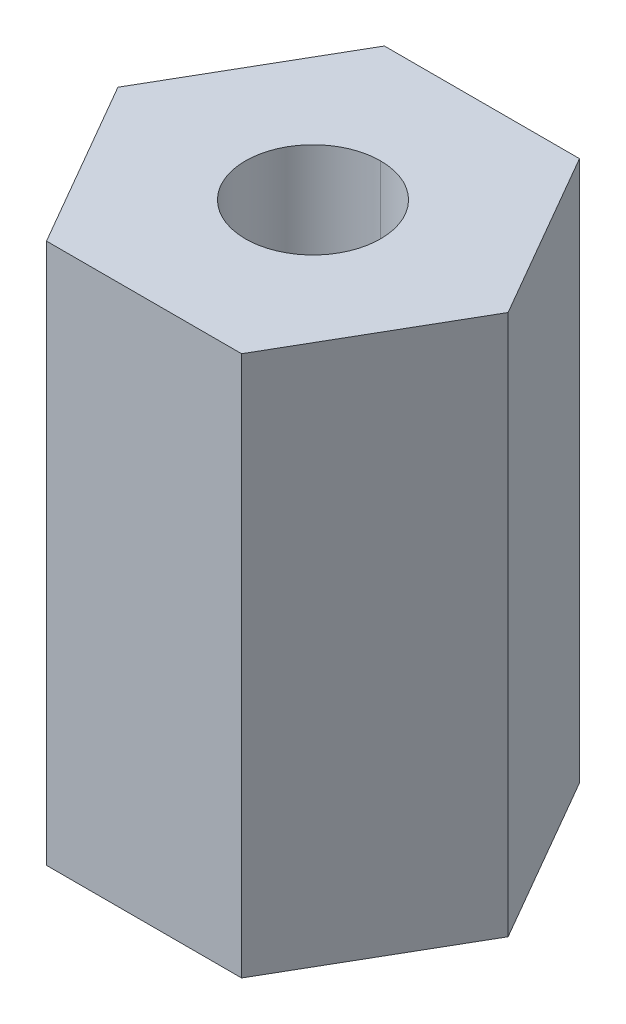
ISO-10303-21;
HEADER;
FILE_DESCRIPTION(('STEP AP214'),'2;1');
FILE_NAME('part.step','',(''),(''),'','','');
FILE_SCHEMA(('AUTOMOTIVE_DESIGN { 1 0 10303 214 1 1 1 1 }'));
ENDSEC;
DATA;
#1=APPLICATION_CONTEXT('core data for automotive mechanical design processes');
#2=APPLICATION_PROTOCOL_DEFINITION('international standard','automotive_design',2000,#1);
#3=PRODUCT_CONTEXT('',#1,'mechanical');
#4=PRODUCT('Part','Part','',(#3));
#5=PRODUCT_RELATED_PRODUCT_CATEGORY('part','',(#4));
#6=PRODUCT_DEFINITION_FORMATION('','',#4);
#7=PRODUCT_DEFINITION_CONTEXT('part definition',#1,'design');
#8=PRODUCT_DEFINITION('design','',#6,#7);
#9=PRODUCT_DEFINITION_SHAPE('','',#8);
#10=(LENGTH_UNIT() NAMED_UNIT(*) SI_UNIT(.MILLI.,.METRE.));
#11=(NAMED_UNIT(*) PLANE_ANGLE_UNIT() SI_UNIT($,.RADIAN.));
#12=(NAMED_UNIT(*) SI_UNIT($,.STERADIAN.) SOLID_ANGLE_UNIT());
#13=UNCERTAINTY_MEASURE_WITH_UNIT(LENGTH_MEASURE(1.E-05),#10,'distance_accuracy_value','');
#14=(GEOMETRIC_REPRESENTATION_CONTEXT(3) GLOBAL_UNCERTAINTY_ASSIGNED_CONTEXT((#13)) GLOBAL_UNIT_ASSIGNED_CONTEXT((#10,
#11,#12)) REPRESENTATION_CONTEXT('',''));
#15=CARTESIAN_POINT('',(0.,0.,0.));
#16=DIRECTION('',(0.,0.,1.));
#17=DIRECTION('',(1.,0.,0.));
#18=AXIS2_PLACEMENT_3D('',#15,#16,#17);
#19=CARTESIAN_POINT('',(0.,8.,1.));
#20=CARTESIAN_POINT('',(-1.,7.99999999999999,1.));
#21=CARTESIAN_POINT('',(-1.,8.,0.));
#22=CARTESIAN_POINT('',(-1.,7.99999999999999,-1.));
#23=CARTESIAN_POINT('',(0.,8.,-1.));
#24=CARTESIAN_POINT('',(0.,0.,1.));
#25=CARTESIAN_POINT('',(-1.,0.,1.));
#26=CARTESIAN_POINT('',(-1.,0.,0.));
#27=CARTESIAN_POINT('',(-1.,0.,-1.));
#28=CARTESIAN_POINT('',(0.,0.,-1.));
#29=(BOUNDED_SURFACE() B_SPLINE_SURFACE(1,2,((#19,#20,#21,#22,#23),(#24,#25,#26,#27,#28)),
.UNSPECIFIED.,.F.,.F.,.F.) B_SPLINE_SURFACE_WITH_KNOTS((2,2),(3,2,3),(-4.,4.),
(-3.14159265358979,-1.5707963267949,0.),
.UNSPECIFIED.) GEOMETRIC_REPRESENTATION_ITEM() RATIONAL_B_SPLINE_SURFACE(((1.,0.707106781186548,
1.,0.707106781186548,1.),(1.,0.707106781186548,1.,0.707106781186548,1.))) REPRESENTATION_ITEM('') SURFACE());
#30=CARTESIAN_POINT('',(0.,8.,-1.));
#31=CARTESIAN_POINT('',(0.,0.,-1.));
#32=(BOUNDED_CURVE() B_SPLINE_CURVE(1,(#30,#31),.UNSPECIFIED.,.F.,
.F.) B_SPLINE_CURVE_WITH_KNOTS((2,2),(-4.,4.),
.UNSPECIFIED.) CURVE() GEOMETRIC_REPRESENTATION_ITEM() RATIONAL_B_SPLINE_CURVE((1.,1.)) REPRESENTATION_ITEM(''));
#33=CARTESIAN_POINT('',(0.,8.,-1.));
#34=VERTEX_POINT('',#33);
#35=CARTESIAN_POINT('',(0.,0.,-1.));
#36=VERTEX_POINT('',#35);
#37=EDGE_CURVE('E193',#34,#36,#32,.T.);
#38=CARTESIAN_POINT('',(0.,8.,1.));
#39=CARTESIAN_POINT('',(-1.,7.99999999999999,1.));
#40=CARTESIAN_POINT('',(-1.,8.,0.));
#41=CARTESIAN_POINT('',(-1.,7.99999999999999,-1.));
#42=CARTESIAN_POINT('',(0.,8.,-1.));
#43=(BOUNDED_CURVE() B_SPLINE_CURVE(2,(#38,#39,#40,#41,#42),.UNSPECIFIED.,.F.,
.F.) B_SPLINE_CURVE_WITH_KNOTS((3,2,3),(0.,1.5707963267949,3.14159265358979),
.UNSPECIFIED.) CURVE() GEOMETRIC_REPRESENTATION_ITEM() RATIONAL_B_SPLINE_CURVE((1.,
0.707106781186548,1.,0.707106781186548,1.)) REPRESENTATION_ITEM(''));
#44=CARTESIAN_POINT('',(0.,8.,1.));
#45=VERTEX_POINT('',#44);
#46=EDGE_CURVE('E82',#45,#34,#43,.T.);
#47=CARTESIAN_POINT('',(0.,8.,1.));
#48=CARTESIAN_POINT('',(0.,0.,1.));
#49=(BOUNDED_CURVE() B_SPLINE_CURVE(1,(#47,#48),.UNSPECIFIED.,.F.,
.F.) B_SPLINE_CURVE_WITH_KNOTS((2,2),(-4.,4.),
.UNSPECIFIED.) CURVE() GEOMETRIC_REPRESENTATION_ITEM() RATIONAL_B_SPLINE_CURVE((1.,1.)) REPRESENTATION_ITEM(''));
#50=CARTESIAN_POINT('',(0.,0.,1.));
#51=VERTEX_POINT('',#50);
#52=EDGE_CURVE('E150',#45,#51,#49,.T.);
#53=CARTESIAN_POINT('',(0.,0.,1.));
#54=CARTESIAN_POINT('',(-1.,0.,1.));
#55=CARTESIAN_POINT('',(-1.,0.,0.));
#56=CARTESIAN_POINT('',(-1.,0.,-1.));
#57=CARTESIAN_POINT('',(0.,0.,-1.));
#58=(BOUNDED_CURVE() B_SPLINE_CURVE(2,(#53,#54,#55,#56,#57),.UNSPECIFIED.,.F.,
.F.) B_SPLINE_CURVE_WITH_KNOTS((3,2,3),(0.,1.5707963267949,3.14159265358979),
.UNSPECIFIED.) CURVE() GEOMETRIC_REPRESENTATION_ITEM() RATIONAL_B_SPLINE_CURVE((1.,
0.707106781186548,1.,0.707106781186548,1.)) REPRESENTATION_ITEM(''));
#59=EDGE_CURVE('E92',#51,#36,#58,.T.);
#60=ORIENTED_EDGE('',*,*,#37,.F.);
#61=ORIENTED_EDGE('',*,*,#46,.F.);
#62=ORIENTED_EDGE('',*,*,#52,.T.);
#63=ORIENTED_EDGE('',*,*,#59,.T.);
#64=EDGE_LOOP('',(#60,#61,#62,#63));
#65=FACE_BOUND('',#64,.T.);
#66=ADVANCED_FACE('F17',(#65),#29,.T.);
#67=CARTESIAN_POINT('',(1.43837567300093,-0.01,2.50866025403838));
#68=CARTESIAN_POINT('',(1.43837567300093,8.01,2.50866025403838));
#69=CARTESIAN_POINT('',(2.89175134571016,-0.01,-0.00866025420518224));
#70=CARTESIAN_POINT('',(2.89175134571016,8.01,-0.00866025420518224));
#71=(BOUNDED_SURFACE() B_SPLINE_SURFACE(1,1,((#67,#68),(#69,#70)),.UNSPECIFIED.,.F.,.F.,
.F.) B_SPLINE_SURFACE_WITH_KNOTS((2,2),(2,2),(-0.28967513459611,0.001),(-0.801,0.001),
.UNSPECIFIED.) GEOMETRIC_REPRESENTATION_ITEM() RATIONAL_B_SPLINE_SURFACE(((1.,1.),(1.,1.))) REPRESENTATION_ITEM('') SURFACE());
#72=CARTESIAN_POINT('',(1.443375673,0.,2.5));
#73=CARTESIAN_POINT('',(2.886751346,0.,0.));
#74=(BOUNDED_CURVE() B_SPLINE_CURVE(1,(#72,#73),.UNSPECIFIED.,.F.,
.F.) B_SPLINE_CURVE_WITH_KNOTS((2,2),(0.,1.),
.UNSPECIFIED.) CURVE() GEOMETRIC_REPRESENTATION_ITEM() RATIONAL_B_SPLINE_CURVE((1.,1.)) REPRESENTATION_ITEM(''));
#75=CARTESIAN_POINT('',(1.443375673,0.,2.5));
#76=VERTEX_POINT('',#75);
#77=CARTESIAN_POINT('',(2.886751346,0.,0.));
#78=VERTEX_POINT('',#77);
#79=EDGE_CURVE('E140',#76,#78,#74,.T.);
#80=CARTESIAN_POINT('',(2.886751346,8.,0.));
#81=CARTESIAN_POINT('',(2.886751346,0.,0.));
#82=(BOUNDED_CURVE() B_SPLINE_CURVE(1,(#80,#81),.UNSPECIFIED.,.F.,
.F.) B_SPLINE_CURVE_WITH_KNOTS((2,2),(0.,1.),
.UNSPECIFIED.) CURVE() GEOMETRIC_REPRESENTATION_ITEM() RATIONAL_B_SPLINE_CURVE((1.,1.)) REPRESENTATION_ITEM(''));
#83=CARTESIAN_POINT('',(2.886751346,8.,0.));
#84=VERTEX_POINT('',#83);
#85=EDGE_CURVE('E11',#84,#78,#82,.T.);
#86=CARTESIAN_POINT('',(1.443375673,8.,2.5));
#87=CARTESIAN_POINT('',(2.886751346,8.,0.));
#88=(BOUNDED_CURVE() B_SPLINE_CURVE(1,(#86,#87),.UNSPECIFIED.,.F.,
.F.) B_SPLINE_CURVE_WITH_KNOTS((2,2),(0.,1.),
.UNSPECIFIED.) CURVE() GEOMETRIC_REPRESENTATION_ITEM() RATIONAL_B_SPLINE_CURVE((1.,1.)) REPRESENTATION_ITEM(''));
#89=CARTESIAN_POINT('',(1.443375673,8.,2.5));
#90=VERTEX_POINT('',#89);
#91=EDGE_CURVE('E246',#90,#84,#88,.T.);
#92=CARTESIAN_POINT('',(1.443375673,8.,2.5));
#93=CARTESIAN_POINT('',(1.443375673,0.,2.5));
#94=(BOUNDED_CURVE() B_SPLINE_CURVE(1,(#92,#93),.UNSPECIFIED.,.F.,
.F.) B_SPLINE_CURVE_WITH_KNOTS((2,2),(0.,1.),
.UNSPECIFIED.) CURVE() GEOMETRIC_REPRESENTATION_ITEM() RATIONAL_B_SPLINE_CURVE((1.,1.)) REPRESENTATION_ITEM(''));
#95=EDGE_CURVE('E146',#90,#76,#94,.T.);
#96=ORIENTED_EDGE('',*,*,#79,.T.);
#97=ORIENTED_EDGE('',*,*,#85,.F.);
#98=ORIENTED_EDGE('',*,*,#91,.F.);
#99=ORIENTED_EDGE('',*,*,#95,.T.);
#100=EDGE_LOOP('',(#96,#97,#98,#99));
#101=FACE_BOUND('',#100,.T.);
#102=ADVANCED_FACE('F145',(#101),#71,.T.);
#103=CARTESIAN_POINT('',(2.89175134599907,-0.01,0.00866025403838329));
#104=CARTESIAN_POINT('',(2.89175134599907,8.01,0.00866025403838344));
#105=CARTESIAN_POINT('',(1.43837567328984,-0.01,-2.50866025420518));
#106=CARTESIAN_POINT('',(1.43837567328984,8.01,-2.50866025420518));
#107=(BOUNDED_SURFACE() B_SPLINE_SURFACE(1,1,((#103,#104),(#105,#106)),.UNSPECIFIED.,.F.,.F.,
.F.) B_SPLINE_SURFACE_WITH_KNOTS((2,2),(2,2),(-0.28967513459611,0.001),(-0.801,0.001),
.UNSPECIFIED.) GEOMETRIC_REPRESENTATION_ITEM() RATIONAL_B_SPLINE_SURFACE(((1.,1.),(1.,1.))) REPRESENTATION_ITEM('') SURFACE());
#108=CARTESIAN_POINT('',(2.886751346,0.,0.));
#109=CARTESIAN_POINT('',(1.443375673,0.,-2.5));
#110=(BOUNDED_CURVE() B_SPLINE_CURVE(1,(#108,#109),.UNSPECIFIED.,.F.,
.F.) B_SPLINE_CURVE_WITH_KNOTS((2,2),(0.,1.),
.UNSPECIFIED.) CURVE() GEOMETRIC_REPRESENTATION_ITEM() RATIONAL_B_SPLINE_CURVE((1.,1.)) REPRESENTATION_ITEM(''));
#111=CARTESIAN_POINT('',(1.443375673,0.,-2.5));
#112=VERTEX_POINT('',#111);
#113=EDGE_CURVE('E128',#78,#112,#110,.T.);
#114=CARTESIAN_POINT('',(1.443375673,8.,-2.5));
#115=CARTESIAN_POINT('',(1.443375673,0.,-2.5));
#116=(BOUNDED_CURVE() B_SPLINE_CURVE(1,(#114,#115),.UNSPECIFIED.,.F.,
.F.) B_SPLINE_CURVE_WITH_KNOTS((2,2),(0.,1.),
.UNSPECIFIED.) CURVE() GEOMETRIC_REPRESENTATION_ITEM() RATIONAL_B_SPLINE_CURVE((1.,1.)) REPRESENTATION_ITEM(''));
#117=CARTESIAN_POINT('',(1.443375673,8.,-2.5));
#118=VERTEX_POINT('',#117);
#119=EDGE_CURVE('E31',#118,#112,#116,.T.);
#120=CARTESIAN_POINT('',(2.886751346,8.,0.));
#121=CARTESIAN_POINT('',(1.443375673,8.,-2.5));
#122=(BOUNDED_CURVE() B_SPLINE_CURVE(1,(#120,#121),.UNSPECIFIED.,.F.,
.F.) B_SPLINE_CURVE_WITH_KNOTS((2,2),(0.,1.),
.UNSPECIFIED.) CURVE() GEOMETRIC_REPRESENTATION_ITEM() RATIONAL_B_SPLINE_CURVE((1.,1.)) REPRESENTATION_ITEM(''));
#123=EDGE_CURVE('E131',#84,#118,#122,.T.);
#124=ORIENTED_EDGE('',*,*,#113,.T.);
#125=ORIENTED_EDGE('',*,*,#119,.F.);
#126=ORIENTED_EDGE('',*,*,#123,.F.);
#127=ORIENTED_EDGE('',*,*,#85,.T.);
#128=EDGE_LOOP('',(#124,#125,#126,#127));
#129=FACE_BOUND('',#128,.T.);
#130=ADVANCED_FACE('F127',(#129),#107,.T.);
#131=CARTESIAN_POINT('',(1.453375673,-0.01,-2.5));
#132=CARTESIAN_POINT('',(1.453375673,8.01,-2.5));
#133=CARTESIAN_POINT('',(-1.453375673,-0.01,-2.5));
#134=CARTESIAN_POINT('',(-1.453375673,8.01,-2.5));
#135=(BOUNDED_SURFACE() B_SPLINE_SURFACE(1,1,((#131,#132),(#133,#134)),.UNSPECIFIED.,.F.,.F.,
.F.) B_SPLINE_SURFACE_WITH_KNOTS((2,2),(2,2),(-0.2896751346,0.001),(-0.801,0.001),
.UNSPECIFIED.) GEOMETRIC_REPRESENTATION_ITEM() RATIONAL_B_SPLINE_SURFACE(((1.,1.),(1.,1.))) REPRESENTATION_ITEM('') SURFACE());
#136=CARTESIAN_POINT('',(1.443375673,0.,-2.5));
#137=CARTESIAN_POINT('',(-1.443375673,0.,-2.5));
#138=(BOUNDED_CURVE() B_SPLINE_CURVE(1,(#136,#137),.UNSPECIFIED.,.F.,
.F.) B_SPLINE_CURVE_WITH_KNOTS((2,2),(0.,1.),
.UNSPECIFIED.) CURVE() GEOMETRIC_REPRESENTATION_ITEM() RATIONAL_B_SPLINE_CURVE((1.,1.)) REPRESENTATION_ITEM(''));
#139=CARTESIAN_POINT('',(-1.443375673,0.,-2.5));
#140=VERTEX_POINT('',#139);
#141=EDGE_CURVE('E142',#112,#140,#138,.T.);
#142=CARTESIAN_POINT('',(-1.443375673,8.,-2.5));
#143=CARTESIAN_POINT('',(-1.443375673,0.,-2.5));
#144=(BOUNDED_CURVE() B_SPLINE_CURVE(1,(#142,#143),.UNSPECIFIED.,.F.,
.F.) B_SPLINE_CURVE_WITH_KNOTS((2,2),(0.,1.),
.UNSPECIFIED.) CURVE() GEOMETRIC_REPRESENTATION_ITEM() RATIONAL_B_SPLINE_CURVE((1.,1.)) REPRESENTATION_ITEM(''));
#145=CARTESIAN_POINT('',(-1.443375673,8.,-2.5));
#146=VERTEX_POINT('',#145);
#147=EDGE_CURVE('E117',#146,#140,#144,.T.);
#148=CARTESIAN_POINT('',(1.443375673,8.,-2.5));
#149=CARTESIAN_POINT('',(-1.443375673,8.,-2.5));
#150=(BOUNDED_CURVE() B_SPLINE_CURVE(1,(#148,#149),.UNSPECIFIED.,.F.,
.F.) B_SPLINE_CURVE_WITH_KNOTS((2,2),(0.,1.),
.UNSPECIFIED.) CURVE() GEOMETRIC_REPRESENTATION_ITEM() RATIONAL_B_SPLINE_CURVE((1.,1.)) REPRESENTATION_ITEM(''));
#151=EDGE_CURVE('E201',#118,#146,#150,.T.);
#152=ORIENTED_EDGE('',*,*,#141,.T.);
#153=ORIENTED_EDGE('',*,*,#147,.F.);
#154=ORIENTED_EDGE('',*,*,#151,.F.);
#155=ORIENTED_EDGE('',*,*,#119,.T.);
#156=EDGE_LOOP('',(#152,#153,#154,#155));
#157=FACE_BOUND('',#156,.T.);
#158=ADVANCED_FACE('F283',(#157),#135,.T.);
#159=CARTESIAN_POINT('',(-1.43837567300093,-0.01,-2.50866025403838));
#160=CARTESIAN_POINT('',(-1.43837567300093,8.01,-2.50866025403838));
#161=CARTESIAN_POINT('',(-2.89175134571016,-0.01,0.00866025420518224));
#162=CARTESIAN_POINT('',(-2.89175134571016,8.01,0.00866025420518224));
#163=(BOUNDED_SURFACE() B_SPLINE_SURFACE(1,1,((#159,#160),(#161,#162)),.UNSPECIFIED.,.F.,.F.,
.F.) B_SPLINE_SURFACE_WITH_KNOTS((2,2),(2,2),(-0.28967513459611,0.001),(-0.801,0.001),
.UNSPECIFIED.) GEOMETRIC_REPRESENTATION_ITEM() RATIONAL_B_SPLINE_SURFACE(((1.,1.),(1.,1.))) REPRESENTATION_ITEM('') SURFACE());
#164=CARTESIAN_POINT('',(-1.443375673,0.,-2.5));
#165=CARTESIAN_POINT('',(-2.886751346,0.,0.));
#166=(BOUNDED_CURVE() B_SPLINE_CURVE(1,(#164,#165),.UNSPECIFIED.,.F.,
.F.) B_SPLINE_CURVE_WITH_KNOTS((2,2),(0.,1.),
.UNSPECIFIED.) CURVE() GEOMETRIC_REPRESENTATION_ITEM() RATIONAL_B_SPLINE_CURVE((1.,1.)) REPRESENTATION_ITEM(''));
#167=CARTESIAN_POINT('',(-2.886751346,0.,0.));
#168=VERTEX_POINT('',#167);
#169=EDGE_CURVE('E169',#140,#168,#166,.T.);
#170=CARTESIAN_POINT('',(-2.886751346,8.,0.));
#171=CARTESIAN_POINT('',(-2.886751346,0.,0.));
#172=(BOUNDED_CURVE() B_SPLINE_CURVE(1,(#170,#171),.UNSPECIFIED.,.F.,
.F.) B_SPLINE_CURVE_WITH_KNOTS((2,2),(0.,1.),
.UNSPECIFIED.) CURVE() GEOMETRIC_REPRESENTATION_ITEM() RATIONAL_B_SPLINE_CURVE((1.,1.)) REPRESENTATION_ITEM(''));
#173=CARTESIAN_POINT('',(-2.886751346,8.,0.));
#174=VERTEX_POINT('',#173);
#175=EDGE_CURVE('E176',#174,#168,#172,.T.);
#176=CARTESIAN_POINT('',(-1.443375673,8.,-2.5));
#177=CARTESIAN_POINT('',(-2.886751346,8.,0.));
#178=(BOUNDED_CURVE() B_SPLINE_CURVE(1,(#176,#177),.UNSPECIFIED.,.F.,
.F.) B_SPLINE_CURVE_WITH_KNOTS((2,2),(0.,1.),
.UNSPECIFIED.) CURVE() GEOMETRIC_REPRESENTATION_ITEM() RATIONAL_B_SPLINE_CURVE((1.,1.)) REPRESENTATION_ITEM(''));
#179=EDGE_CURVE('E210',#146,#174,#178,.T.);
#180=ORIENTED_EDGE('',*,*,#169,.T.);
#181=ORIENTED_EDGE('',*,*,#175,.F.);
#182=ORIENTED_EDGE('',*,*,#179,.F.);
#183=ORIENTED_EDGE('',*,*,#147,.T.);
#184=EDGE_LOOP('',(#180,#181,#182,#183));
#185=FACE_BOUND('',#184,.T.);
#186=ADVANCED_FACE('F278',(#185),#163,.T.);
#187=CARTESIAN_POINT('',(-2.89175134599907,-0.01,-0.00866025403838329));
#188=CARTESIAN_POINT('',(-2.89175134599907,8.01,-0.00866025403838344));
#189=CARTESIAN_POINT('',(-1.43837567328984,-0.01,2.50866025420518));
#190=CARTESIAN_POINT('',(-1.43837567328984,8.01,2.50866025420518));
#191=(BOUNDED_SURFACE() B_SPLINE_SURFACE(1,1,((#187,#188),(#189,#190)),.UNSPECIFIED.,.F.,.F.,
.F.) B_SPLINE_SURFACE_WITH_KNOTS((2,2),(2,2),(-0.28967513459611,0.001),(-0.801,0.001),
.UNSPECIFIED.) GEOMETRIC_REPRESENTATION_ITEM() RATIONAL_B_SPLINE_SURFACE(((1.,1.),(1.,1.))) REPRESENTATION_ITEM('') SURFACE());
#192=CARTESIAN_POINT('',(-2.886751346,0.,0.));
#193=CARTESIAN_POINT('',(-1.443375673,0.,2.5));
#194=(BOUNDED_CURVE() B_SPLINE_CURVE(1,(#192,#193),.UNSPECIFIED.,.F.,
.F.) B_SPLINE_CURVE_WITH_KNOTS((2,2),(0.,1.),
.UNSPECIFIED.) CURVE() GEOMETRIC_REPRESENTATION_ITEM() RATIONAL_B_SPLINE_CURVE((1.,1.)) REPRESENTATION_ITEM(''));
#195=CARTESIAN_POINT('',(-1.443375673,0.,2.5));
#196=VERTEX_POINT('',#195);
#197=EDGE_CURVE('E157',#168,#196,#194,.T.);
#198=CARTESIAN_POINT('',(-1.443375673,8.,2.5));
#199=CARTESIAN_POINT('',(-1.443375673,0.,2.5));
#200=(BOUNDED_CURVE() B_SPLINE_CURVE(1,(#198,#199),.UNSPECIFIED.,.F.,
.F.) B_SPLINE_CURVE_WITH_KNOTS((2,2),(0.,1.),
.UNSPECIFIED.) CURVE() GEOMETRIC_REPRESENTATION_ITEM() RATIONAL_B_SPLINE_CURVE((1.,1.)) REPRESENTATION_ITEM(''));
#201=CARTESIAN_POINT('',(-1.443375673,8.,2.5));
#202=VERTEX_POINT('',#201);
#203=EDGE_CURVE('E45',#202,#196,#200,.T.);
#204=CARTESIAN_POINT('',(-2.886751346,8.,0.));
#205=CARTESIAN_POINT('',(-1.443375673,8.,2.5));
#206=(BOUNDED_CURVE() B_SPLINE_CURVE(1,(#204,#205),.UNSPECIFIED.,.F.,
.F.) B_SPLINE_CURVE_WITH_KNOTS((2,2),(0.,1.),
.UNSPECIFIED.) CURVE() GEOMETRIC_REPRESENTATION_ITEM() RATIONAL_B_SPLINE_CURVE((1.,1.)) REPRESENTATION_ITEM(''));
#207=EDGE_CURVE('E226',#174,#202,#206,.T.);
#208=ORIENTED_EDGE('',*,*,#197,.T.);
#209=ORIENTED_EDGE('',*,*,#203,.F.);
#210=ORIENTED_EDGE('',*,*,#207,.F.);
#211=ORIENTED_EDGE('',*,*,#175,.T.);
#212=EDGE_LOOP('',(#208,#209,#210,#211));
#213=FACE_BOUND('',#212,.T.);
#214=ADVANCED_FACE('F277',(#213),#191,.T.);
#215=CARTESIAN_POINT('',(-1.453375673,-0.01,2.5));
#216=CARTESIAN_POINT('',(-1.453375673,8.01,2.5));
#217=CARTESIAN_POINT('',(1.453375673,-0.01,2.5));
#218=CARTESIAN_POINT('',(1.453375673,8.01,2.5));
#219=(BOUNDED_SURFACE() B_SPLINE_SURFACE(1,1,((#215,#216),(#217,#218)),.UNSPECIFIED.,.F.,.F.,
.F.) B_SPLINE_SURFACE_WITH_KNOTS((2,2),(2,2),(-0.2896751346,0.001),(-0.801,0.001),
.UNSPECIFIED.) GEOMETRIC_REPRESENTATION_ITEM() RATIONAL_B_SPLINE_SURFACE(((1.,1.),(1.,1.))) REPRESENTATION_ITEM('') SURFACE());
#220=CARTESIAN_POINT('',(-1.443375673,0.,2.5));
#221=CARTESIAN_POINT('',(1.443375673,0.,2.5));
#222=(BOUNDED_CURVE() B_SPLINE_CURVE(1,(#220,#221),.UNSPECIFIED.,.F.,
.F.) B_SPLINE_CURVE_WITH_KNOTS((2,2),(0.,1.),
.UNSPECIFIED.) CURVE() GEOMETRIC_REPRESENTATION_ITEM() RATIONAL_B_SPLINE_CURVE((1.,1.)) REPRESENTATION_ITEM(''));
#223=EDGE_CURVE('E149',#196,#76,#222,.T.);
#224=CARTESIAN_POINT('',(-1.443375673,8.,2.5));
#225=CARTESIAN_POINT('',(1.443375673,8.,2.5));
#226=(BOUNDED_CURVE() B_SPLINE_CURVE(1,(#224,#225),.UNSPECIFIED.,.F.,
.F.) B_SPLINE_CURVE_WITH_KNOTS((2,2),(0.,1.),
.UNSPECIFIED.) CURVE() GEOMETRIC_REPRESENTATION_ITEM() RATIONAL_B_SPLINE_CURVE((1.,1.)) REPRESENTATION_ITEM(''));
#227=EDGE_CURVE('E274',#202,#90,#226,.T.);
#228=ORIENTED_EDGE('',*,*,#223,.T.);
#229=ORIENTED_EDGE('',*,*,#95,.F.);
#230=ORIENTED_EDGE('',*,*,#227,.F.);
#231=ORIENTED_EDGE('',*,*,#203,.T.);
#232=EDGE_LOOP('',(#228,#229,#230,#231));
#233=FACE_BOUND('',#232,.T.);
#234=ADVANCED_FACE('F272',(#233),#219,.T.);
#235=CARTESIAN_POINT('',(-2.896751346,8.,-2.51));
#236=CARTESIAN_POINT('',(2.896751346,8.,-2.51));
#237=CARTESIAN_POINT('',(-2.896751346,8.,2.51));
#238=CARTESIAN_POINT('',(2.896751346,8.,2.51));
#239=(BOUNDED_SURFACE() B_SPLINE_SURFACE(1,1,((#235,#236),(#237,#238)),.UNSPECIFIED.,.F.,.F.,
.F.) B_SPLINE_SURFACE_WITH_KNOTS((2,2),(2,2),(-0.251,0.251),(-0.2896751346,0.2896751346),
.UNSPECIFIED.) GEOMETRIC_REPRESENTATION_ITEM() RATIONAL_B_SPLINE_SURFACE(((1.,1.),(1.,1.))) REPRESENTATION_ITEM('') SURFACE());
#240=CARTESIAN_POINT('',(0.,8.,-1.));
#241=CARTESIAN_POINT('',(1.,7.99999999999999,-1.));
#242=CARTESIAN_POINT('',(1.,8.,0.));
#243=CARTESIAN_POINT('',(1.,7.99999999999999,1.));
#244=CARTESIAN_POINT('',(0.,8.,1.));
#245=(BOUNDED_CURVE() B_SPLINE_CURVE(2,(#240,#241,#242,#243,#244),.UNSPECIFIED.,.F.,
.F.) B_SPLINE_CURVE_WITH_KNOTS((3,2,3),(-3.14159265358979,-1.5707963267949,0.),
.UNSPECIFIED.) CURVE() GEOMETRIC_REPRESENTATION_ITEM() RATIONAL_B_SPLINE_CURVE((1.,
0.707106781186548,1.,0.707106781186548,1.)) REPRESENTATION_ITEM(''));
#246=EDGE_CURVE('E184',#34,#45,#245,.T.);
#247=ORIENTED_EDGE('',*,*,#246,.T.);
#248=ORIENTED_EDGE('',*,*,#46,.T.);
#249=EDGE_LOOP('',(#247,#248));
#250=FACE_BOUND('',#249,.T.);
#251=ORIENTED_EDGE('',*,*,#91,.T.);
#252=ORIENTED_EDGE('',*,*,#123,.T.);
#253=ORIENTED_EDGE('',*,*,#151,.T.);
#254=ORIENTED_EDGE('',*,*,#179,.T.);
#255=ORIENTED_EDGE('',*,*,#207,.T.);
#256=ORIENTED_EDGE('',*,*,#227,.T.);
#257=EDGE_LOOP('',(#251,#252,#253,#254,#255,#256));
#258=FACE_BOUND('',#257,.T.);
#259=ADVANCED_FACE('F282',(#250,#258),#239,.T.);
#260=CARTESIAN_POINT('',(-2.896751346,0.,2.51));
#261=CARTESIAN_POINT('',(2.896751346,0.,2.51));
#262=CARTESIAN_POINT('',(-2.896751346,0.,-2.51));
#263=CARTESIAN_POINT('',(2.896751346,0.,-2.51));
#264=(BOUNDED_SURFACE() B_SPLINE_SURFACE(1,1,((#260,#261),(#262,#263)),.UNSPECIFIED.,.F.,.F.,
.F.) B_SPLINE_SURFACE_WITH_KNOTS((2,2),(2,2),(-0.251,0.251),(-0.2896751346,0.2896751346),
.UNSPECIFIED.) GEOMETRIC_REPRESENTATION_ITEM() RATIONAL_B_SPLINE_SURFACE(((1.,1.),(1.,1.))) REPRESENTATION_ITEM('') SURFACE());
#265=CARTESIAN_POINT('',(0.,0.,-1.));
#266=CARTESIAN_POINT('',(1.,0.,-1.));
#267=CARTESIAN_POINT('',(1.,0.,0.));
#268=CARTESIAN_POINT('',(1.,0.,1.));
#269=CARTESIAN_POINT('',(0.,0.,1.));
#270=(BOUNDED_CURVE() B_SPLINE_CURVE(2,(#265,#266,#267,#268,#269),.UNSPECIFIED.,.F.,
.F.) B_SPLINE_CURVE_WITH_KNOTS((3,2,3),(-3.14159265358979,-1.5707963267949,0.),
.UNSPECIFIED.) CURVE() GEOMETRIC_REPRESENTATION_ITEM() RATIONAL_B_SPLINE_CURVE((1.,
0.707106781186548,1.,0.707106781186548,1.)) REPRESENTATION_ITEM(''));
#271=EDGE_CURVE('E160',#36,#51,#270,.T.);
#272=ORIENTED_EDGE('',*,*,#271,.F.);
#273=ORIENTED_EDGE('',*,*,#59,.F.);
#274=EDGE_LOOP('',(#272,#273));
#275=FACE_BOUND('',#274,.T.);
#276=ORIENTED_EDGE('',*,*,#79,.F.);
#277=ORIENTED_EDGE('',*,*,#223,.F.);
#278=ORIENTED_EDGE('',*,*,#197,.F.);
#279=ORIENTED_EDGE('',*,*,#169,.F.);
#280=ORIENTED_EDGE('',*,*,#141,.F.);
#281=ORIENTED_EDGE('',*,*,#113,.F.);
#282=EDGE_LOOP('',(#276,#277,#278,#279,#280,#281));
#283=FACE_BOUND('',#282,.T.);
#284=ADVANCED_FACE('F138',(#275,#283),#264,.T.);
#285=CARTESIAN_POINT('',(0.,8.,-1.));
#286=CARTESIAN_POINT('',(1.,7.99999999999999,-1.));
#287=CARTESIAN_POINT('',(1.,8.,0.));
#288=CARTESIAN_POINT('',(1.,7.99999999999999,1.));
#289=CARTESIAN_POINT('',(0.,8.,1.));
#290=CARTESIAN_POINT('',(0.,0.,-1.));
#291=CARTESIAN_POINT('',(1.,0.,-1.));
#292=CARTESIAN_POINT('',(1.,0.,0.));
#293=CARTESIAN_POINT('',(1.,0.,1.));
#294=CARTESIAN_POINT('',(0.,0.,1.));
#295=(BOUNDED_SURFACE() B_SPLINE_SURFACE(1,2,((#285,#286,#287,#288,#289),(#290,#291,#292,#293,
#294)),.UNSPECIFIED.,.F.,.F.,.F.) B_SPLINE_SURFACE_WITH_KNOTS((2,2),(3,2,3),(-4.,4.),(0.,
1.5707963267949,3.14159265358979),
.UNSPECIFIED.) GEOMETRIC_REPRESENTATION_ITEM() RATIONAL_B_SPLINE_SURFACE(((1.,0.707106781186548,
1.,0.707106781186548,1.),(1.,0.707106781186548,1.,0.707106781186548,1.))) REPRESENTATION_ITEM('') SURFACE());
#296=ORIENTED_EDGE('',*,*,#246,.F.);
#297=ORIENTED_EDGE('',*,*,#37,.T.);
#298=ORIENTED_EDGE('',*,*,#271,.T.);
#299=ORIENTED_EDGE('',*,*,#52,.F.);
#300=EDGE_LOOP('',(#296,#297,#298,#299));
#301=FACE_BOUND('',#300,.T.);
#302=ADVANCED_FACE('F19',(#301),#295,.T.);
#303=CLOSED_SHELL('',(#66,#102,#130,#158,#186,#214,#234,#259,#284,#302));
#304=MANIFOLD_SOLID_BREP('B1',#303);
#305=ADVANCED_BREP_SHAPE_REPRESENTATION('',(#18,#304),#14);
#306=SHAPE_DEFINITION_REPRESENTATION(#9,#305);
ENDSEC;
END-ISO-10303-21;
